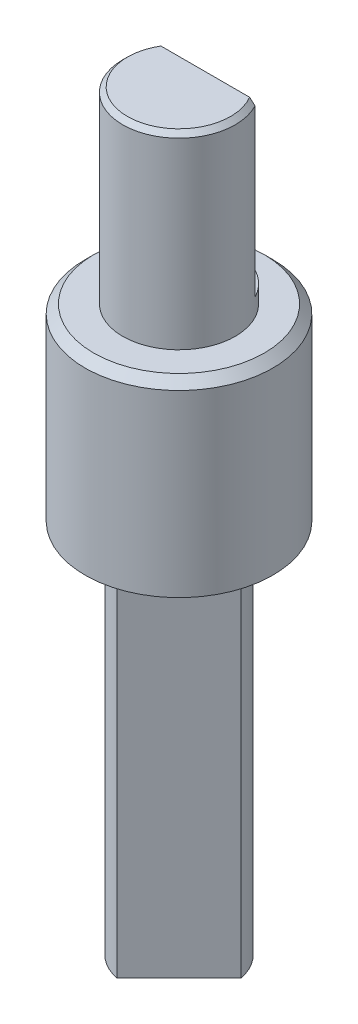
ISO-10303-21;
HEADER;
FILE_DESCRIPTION(('STEP AP214'),'2;1');
FILE_NAME('part.step','',(''),(''),'','','');
FILE_SCHEMA(('AUTOMOTIVE_DESIGN { 1 0 10303 214 1 1 1 1 }'));
ENDSEC;
DATA;
#1=APPLICATION_CONTEXT('core data for automotive mechanical design processes');
#2=APPLICATION_PROTOCOL_DEFINITION('international standard','automotive_design',2000,#1);
#3=PRODUCT_CONTEXT('',#1,'mechanical');
#4=PRODUCT('Part','Part','',(#3));
#5=PRODUCT_RELATED_PRODUCT_CATEGORY('part','',(#4));
#6=PRODUCT_DEFINITION_FORMATION('','',#4);
#7=PRODUCT_DEFINITION_CONTEXT('part definition',#1,'design');
#8=PRODUCT_DEFINITION('design','',#6,#7);
#9=PRODUCT_DEFINITION_SHAPE('','',#8);
#10=(LENGTH_UNIT() NAMED_UNIT(*) SI_UNIT(.MILLI.,.METRE.));
#11=(NAMED_UNIT(*) PLANE_ANGLE_UNIT() SI_UNIT($,.RADIAN.));
#12=(NAMED_UNIT(*) SI_UNIT($,.STERADIAN.) SOLID_ANGLE_UNIT());
#13=UNCERTAINTY_MEASURE_WITH_UNIT(LENGTH_MEASURE(1.E-05),#10,'distance_accuracy_value','');
#14=(GEOMETRIC_REPRESENTATION_CONTEXT(3) GLOBAL_UNCERTAINTY_ASSIGNED_CONTEXT((#13)) GLOBAL_UNIT_ASSIGNED_CONTEXT((#10,
#11,#12)) REPRESENTATION_CONTEXT('',''));
#15=CARTESIAN_POINT('',(0.,0.,0.));
#16=DIRECTION('',(0.,0.,1.));
#17=DIRECTION('',(1.,0.,0.));
#18=AXIS2_PLACEMENT_3D('',#15,#16,#17);
#19=CARTESIAN_POINT('',(0.,20.0152,0.));
#20=DIRECTION('',(0.,-1.,0.));
#21=DIRECTION('',(0.,0.,-1.));
#22=AXIS2_PLACEMENT_3D('',#19,#20,#21);
#23=PLANE('',#22);
#24=CARTESIAN_POINT('',(0.,20.0151999999321,0.));
#25=DIRECTION('',(0.,-1.,0.));
#26=DIRECTION('',(0.,0.,-1.));
#27=AXIS2_PLACEMENT_3D('',#24,#25,#26);
#28=CIRCLE('',#27,2.74319999999761);
#29=CARTESIAN_POINT('',(2.36083401363304,20.015199999943,-1.397));
#30=VERTEX_POINT('',#29);
#31=CARTESIAN_POINT('',(-2.36083401360633,20.015199999966,-1.397));
#32=VERTEX_POINT('',#31);
#33=EDGE_CURVE('E19',#30,#32,#28,.T.);
#34=ORIENTED_EDGE('',*,*,#33,.F.);
#35=DIRECTION('',(1.,0.,0.));
#36=VECTOR('',#35,1.);
#37=CARTESIAN_POINT('',(-2.65171620653493,20.0152,-1.397));
#38=LINE('',#37,#36);
#39=EDGE_CURVE('E97',#30,#32,#38,.F.);
#40=ORIENTED_EDGE('',*,*,#39,.T.);
#41=EDGE_LOOP('',(#34,#40));
#42=FACE_BOUND('',#41,.T.);
#43=ADVANCED_FACE('F16',(#42),#23,.F.);
#44=CARTESIAN_POINT('',(0.,19.7611999999481,0.));
#45=DIRECTION('',(0.,-1.,0.));
#46=DIRECTION('',(0.,0.,-1.));
#47=AXIS2_PLACEMENT_3D('',#44,#45,#46);
#48=CONICAL_SURFACE('',#47,2.9971999999816,0.785398163397448);
#49=ORIENTED_EDGE('',*,*,#33,.T.);
#50=CARTESIAN_POINT('',(-2.36083401362016,20.0151999999541,-1.397));
#51=CARTESIAN_POINT('',(-2.40960348645992,19.9731977034633,-1.397));
#52=CARTESIAN_POINT('',(-2.45822841805287,19.9310298775446,-1.397));
#53=CARTESIAN_POINT('',(-2.5551891487145,19.8463632105385,-1.397));
#54=CARTESIAN_POINT('',(-2.60352494808151,19.8038643697926,-1.397));
#55=CARTESIAN_POINT('',(-2.65171620650003,19.7611999999606,-1.397));
#56=B_SPLINE_CURVE_WITH_KNOTS('',3,(#50,#51,#52,#53,#54,#55),.UNSPECIFIED.,.F.,.F.,(4,2,4),(0.,
0.193086989815871,0.386173780370487),.UNSPECIFIED.);
#57=CARTESIAN_POINT('',(-2.65171620651748,19.7611999999803,-1.397));
#58=VERTEX_POINT('',#57);
#59=EDGE_CURVE('E101',#32,#58,#56,.T.);
#60=ORIENTED_EDGE('',*,*,#59,.T.);
#61=CARTESIAN_POINT('',(0.,19.7612,0.));
#62=DIRECTION('',(0.,1.,0.));
#63=DIRECTION('',(0.,0.,1.));
#64=AXIS2_PLACEMENT_3D('',#61,#62,#63);
#65=CIRCLE('',#64,2.9972);
#66=CARTESIAN_POINT('',(2.65171620651748,19.7611999999803,-1.397));
#67=VERTEX_POINT('',#66);
#68=EDGE_CURVE('E113',#67,#58,#65,.F.);
#69=ORIENTED_EDGE('',*,*,#68,.F.);
#70=CARTESIAN_POINT('',(2.65171620650003,19.7611999999606,-1.397));
#71=CARTESIAN_POINT('',(2.60352494808153,19.8038643697926,-1.397));
#72=CARTESIAN_POINT('',(2.55518914871454,19.8463632105384,-1.397));
#73=CARTESIAN_POINT('',(2.45822841805295,19.9310298775446,-1.397));
#74=CARTESIAN_POINT('',(2.40960348646002,19.9731977034632,-1.397));
#75=CARTESIAN_POINT('',(2.36083401362028,20.015199999954,-1.397));
#76=B_SPLINE_CURVE_WITH_KNOTS('',3,(#70,#71,#72,#73,#74,#75),.UNSPECIFIED.,.F.,.F.,(4,2,4),(0.,
0.193086790554538,0.386173780370333),.UNSPECIFIED.);
#77=EDGE_CURVE('E102',#67,#30,#76,.T.);
#78=ORIENTED_EDGE('',*,*,#77,.T.);
#79=EDGE_LOOP('',(#49,#60,#69,#78));
#80=FACE_BOUND('',#79,.T.);
#81=ADVANCED_FACE('F105',(#80),#48,.T.);
#82=CARTESIAN_POINT('',(0.,10.9474,0.));
#83=DIRECTION('',(0.,1.,0.));
#84=DIRECTION('',(0.,0.,1.));
#85=AXIS2_PLACEMENT_3D('',#82,#83,#84);
#86=PLANE('',#85);
#87=DIRECTION('',(1.,0.,0.));
#88=VECTOR('',#87,1.);
#89=CARTESIAN_POINT('',(-2.65171620653493,10.9474,-1.397));
#90=LINE('',#89,#88);
#91=CARTESIAN_POINT('',(-2.65171620653493,10.9474,-1.397));
#92=VERTEX_POINT('',#91);
#93=CARTESIAN_POINT('',(2.65171620653493,10.9474,-1.397));
#94=VERTEX_POINT('',#93);
#95=EDGE_CURVE('E111',#92,#94,#90,.T.);
#96=ORIENTED_EDGE('',*,*,#95,.T.);
#97=CARTESIAN_POINT('',(0.,10.9474,0.));
#98=DIRECTION('',(0.,1.,0.));
#99=DIRECTION('',(0.,0.,1.));
#100=AXIS2_PLACEMENT_3D('',#97,#98,#99);
#101=CIRCLE('',#100,2.9972);
#102=EDGE_CURVE('E120',#92,#94,#101,.F.);
#103=ORIENTED_EDGE('',*,*,#102,.F.);
#104=EDGE_LOOP('',(#96,#103));
#105=FACE_BOUND('',#104,.T.);
#106=ADVANCED_FACE('F130',(#105),#86,.T.);
#107=CARTESIAN_POINT('',(-2.65171620653493,10.9474,-1.397));
#108=DIRECTION('',(0.,0.,1.));
#109=DIRECTION('',(1.,0.,0.));
#110=AXIS2_PLACEMENT_3D('',#107,#108,#109);
#111=PLANE('',#110);
#112=ORIENTED_EDGE('',*,*,#95,.F.);
#113=DIRECTION('',(0.,1.,0.));
#114=VECTOR('',#113,1.);
#115=CARTESIAN_POINT('',(-2.65171620653493,0.,-1.397));
#116=LINE('',#115,#114);
#117=EDGE_CURVE('E109',#58,#92,#116,.F.);
#118=ORIENTED_EDGE('',*,*,#117,.F.);
#119=ORIENTED_EDGE('',*,*,#59,.F.);
#120=ORIENTED_EDGE('',*,*,#39,.F.);
#121=ORIENTED_EDGE('',*,*,#77,.F.);
#122=DIRECTION('',(0.,1.,0.));
#123=VECTOR('',#122,1.);
#124=CARTESIAN_POINT('',(2.65171620653493,0.,-1.397));
#125=LINE('',#124,#123);
#126=EDGE_CURVE('E210',#94,#67,#125,.T.);
#127=ORIENTED_EDGE('',*,*,#126,.F.);
#128=EDGE_LOOP('',(#112,#118,#119,#120,#121,#127));
#129=FACE_BOUND('',#128,.T.);
#130=ADVANCED_FACE('F107',(#129),#111,.F.);
#131=CARTESIAN_POINT('',(0.,0.,0.));
#132=DIRECTION('',(0.,1.,0.));
#133=DIRECTION('',(0.,0.,1.));
#134=AXIS2_PLACEMENT_3D('',#131,#132,#133);
#135=CYLINDRICAL_SURFACE('',#134,2.9972);
#136=ORIENTED_EDGE('',*,*,#102,.T.);
#137=ORIENTED_EDGE('',*,*,#126,.T.);
#138=ORIENTED_EDGE('',*,*,#68,.T.);
#139=ORIENTED_EDGE('',*,*,#117,.T.);
#140=EDGE_LOOP('',(#136,#137,#138,#139));
#141=FACE_BOUND('',#140,.T.);
#142=CARTESIAN_POINT('',(0.,10.0076,0.));
#143=DIRECTION('',(0.,1.,0.));
#144=DIRECTION('',(0.,0.,1.));
#145=AXIS2_PLACEMENT_3D('',#142,#143,#144);
#146=CIRCLE('',#145,2.9972);
#147=CARTESIAN_POINT('',(0.,10.0076,2.9972));
#148=VERTEX_POINT('',#147);
#149=EDGE_CURVE('E208',#148,#148,#146,.T.);
#150=ORIENTED_EDGE('',*,*,#149,.T.);
#151=EDGE_LOOP('',(#150));
#152=FACE_BOUND('',#151,.T.);
#153=ADVANCED_FACE('F138',(#141,#152),#135,.T.);
#154=CARTESIAN_POINT('',(0.,-19.9898,0.));
#155=DIRECTION('',(0.,1.,0.));
#156=DIRECTION('',(0.,0.,1.));
#157=AXIS2_PLACEMENT_3D('',#154,#155,#156);
#158=PLANE('',#157);
#159=CARTESIAN_POINT('',(0.,-19.9898,0.));
#160=DIRECTION('',(0.,-1.,0.));
#161=DIRECTION('',(0.,0.,-1.));
#162=AXIS2_PLACEMENT_3D('',#159,#160,#161);
#163=CIRCLE('',#162,2.794);
#164=CARTESIAN_POINT('',(2.73350814544977,-19.9898,-0.578246676393178));
#165=VERTEX_POINT('',#164);
#166=CARTESIAN_POINT('',(0.578246676393178,-19.9898,-2.73350814544977));
#167=VERTEX_POINT('',#166);
#168=EDGE_CURVE('E219',#165,#167,#163,.F.);
#169=ORIENTED_EDGE('',*,*,#168,.F.);
#170=DIRECTION('',(0.707106781186547,0.,-0.707106781186548));
#171=VECTOR('',#170,1.);
#172=CARTESIAN_POINT('',(-0.578246676393173,-19.9898,2.73350814544976));
#173=LINE('',#172,#171);
#174=CARTESIAN_POINT('',(-0.578246676393178,-19.9898,2.73350814544977));
#175=VERTEX_POINT('',#174);
#176=EDGE_CURVE('E212',#175,#165,#173,.T.);
#177=ORIENTED_EDGE('',*,*,#176,.F.);
#178=CARTESIAN_POINT('',(0.,-19.9898,0.));
#179=DIRECTION('',(0.,-1.,0.));
#180=DIRECTION('',(0.,0.,-1.));
#181=AXIS2_PLACEMENT_3D('',#178,#179,#180);
#182=CIRCLE('',#181,2.794);
#183=CARTESIAN_POINT('',(-2.73350814544976,-19.9898,0.578246676393176));
#184=VERTEX_POINT('',#183);
#185=EDGE_CURVE('E216',#184,#175,#182,.F.);
#186=ORIENTED_EDGE('',*,*,#185,.F.);
#187=DIRECTION('',(-0.707106781186547,0.,0.707106781186548));
#188=VECTOR('',#187,1.);
#189=CARTESIAN_POINT('',(0.578246676393173,-19.9898,-2.73350814544976));
#190=LINE('',#189,#188);
#191=EDGE_CURVE('E233',#167,#184,#190,.T.);
#192=ORIENTED_EDGE('',*,*,#191,.F.);
#193=EDGE_LOOP('',(#169,#177,#186,#192));
#194=FACE_BOUND('',#193,.T.);
#195=ADVANCED_FACE('F194',(#194),#158,.F.);
#196=CARTESIAN_POINT('',(0.,10.0076,-2.9972));
#197=DIRECTION('',(0.,-1.,0.));
#198=DIRECTION('',(0.,0.,-1.));
#199=AXIS2_PLACEMENT_3D('',#196,#197,#198);
#200=PLANE('',#199);
#201=ORIENTED_EDGE('',*,*,#149,.F.);
#202=EDGE_LOOP('',(#201));
#203=FACE_BOUND('',#202,.T.);
#204=CARTESIAN_POINT('',(0.,10.0075999999945,0.));
#205=DIRECTION('',(0.,-1.,0.));
#206=DIRECTION('',(0.,0.,-1.));
#207=AXIS2_PLACEMENT_3D('',#204,#205,#206);
#208=CIRCLE('',#207,4.54000000001997);
#209=CARTESIAN_POINT('',(0.,10.0075999999945,-4.54000000001997));
#210=VERTEX_POINT('',#209);
#211=EDGE_CURVE('E167',#210,#210,#208,.T.);
#212=ORIENTED_EDGE('',*,*,#211,.F.);
#213=EDGE_LOOP('',(#212));
#214=FACE_BOUND('',#213,.T.);
#215=ADVANCED_FACE('F189',(#203,#214),#200,.F.);
#216=CARTESIAN_POINT('',(-3.50229988721698,25.4,-2.96348451995281));
#217=DIRECTION('',(-0.707106781186548,0.,-0.707106781186548));
#218=DIRECTION('',(-0.707106781186548,0.,0.707106781186548));
#219=AXIS2_PLACEMENT_3D('',#216,#217,#218);
#220=PLANE('',#219);
#221=DIRECTION('',(-0.707106781186548,0.,0.707106781186548));
#222=VECTOR('',#221,1.);
#223=CARTESIAN_POINT('',(-3.50229988721698,0.,-2.96348451995281));
#224=LINE('',#223,#222);
#225=CARTESIAN_POINT('',(-2.96348451995281,0.,-3.50229988721698));
#226=VERTEX_POINT('',#225);
#227=CARTESIAN_POINT('',(-3.50229988721697,0.,-2.96348451995282));
#228=VERTEX_POINT('',#227);
#229=EDGE_CURVE('E209',#226,#228,#224,.T.);
#230=ORIENTED_EDGE('',*,*,#229,.T.);
#231=DIRECTION('',(0.,1.,0.));
#232=VECTOR('',#231,1.);
#233=CARTESIAN_POINT('',(-3.50229988721696,25.4,-2.96348451995282));
#234=LINE('',#233,#232);
#235=CARTESIAN_POINT('',(-3.50229988721751,9.9597524654945,-2.96348451995228));
#236=VERTEX_POINT('',#235);
#237=EDGE_CURVE('E166',#236,#228,#234,.F.);
#238=ORIENTED_EDGE('',*,*,#237,.F.);
#239=CARTESIAN_POINT('',(-2.96348455951795,9.95975249371569,-3.50229994728442));
#240=CARTESIAN_POINT('',(-3.05328709766137,9.97031750260145,-3.41249735932471));
#241=CARTESIAN_POINT('',(-3.14308964396942,9.97560000470103,-3.3226947798058));
#242=CARTESIAN_POINT('',(-3.32269475320279,9.97559999532783,-3.14308963736157));
#243=CARTESIAN_POINT('',(-3.41249731612811,9.97031748382117,-3.05328707443625));
#244=CARTESIAN_POINT('',(-3.50229988721805,9.95975246549444,-2.96348451995173));
#245=B_SPLINE_CURVE_WITH_KNOTS('',3,(#239,#240,#241,#242,#243,#244),.UNSPECIFIED.,.F.,.F.,(4,2,
4),(0.,0.381329449375232,0.762658899973495),.UNSPECIFIED.);
#246=CARTESIAN_POINT('',(-2.96348451568527,9.95975246499336,-3.50229989148452));
#247=VERTEX_POINT('',#246);
#248=EDGE_CURVE('E172',#247,#236,#245,.T.);
#249=ORIENTED_EDGE('',*,*,#248,.F.);
#250=DIRECTION('',(0.,1.,0.));
#251=VECTOR('',#250,1.);
#252=CARTESIAN_POINT('',(-2.96348451995281,25.4,-3.50229988721698));
#253=LINE('',#252,#251);
#254=EDGE_CURVE('E227',#226,#247,#253,.T.);
#255=ORIENTED_EDGE('',*,*,#254,.F.);
#256=EDGE_LOOP('',(#230,#238,#249,#255));
#257=FACE_BOUND('',#256,.T.);
#258=ADVANCED_FACE('F183',(#257),#220,.T.);
#259=CARTESIAN_POINT('',(-0.578246676393173,-19.9898,2.73350814544976));
#260=DIRECTION('',(0.707106781186548,0.,0.707106781186547));
#261=DIRECTION('',(0.707106781186547,0.,-0.707106781186548));
#262=AXIS2_PLACEMENT_3D('',#259,#260,#261);
#263=PLANE('',#262);
#264=ORIENTED_EDGE('',*,*,#176,.T.);
#265=DIRECTION('',(0.,-1.,0.));
#266=VECTOR('',#265,1.);
#267=CARTESIAN_POINT('',(2.73350814544977,-19.9898,-0.578246676393175));
#268=LINE('',#267,#266);
#269=CARTESIAN_POINT('',(2.73350814544977,0.,-0.578246676393178));
#270=VERTEX_POINT('',#269);
#271=EDGE_CURVE('E222',#270,#165,#268,.T.);
#272=ORIENTED_EDGE('',*,*,#271,.F.);
#273=DIRECTION('',(-0.707106781186548,0.,0.707106781186547));
#274=VECTOR('',#273,1.);
#275=CARTESIAN_POINT('',(2.73350814544976,0.,-0.578246676393173));
#276=LINE('',#275,#274);
#277=CARTESIAN_POINT('',(-0.578246676393179,0.,2.73350814544977));
#278=VERTEX_POINT('',#277);
#279=EDGE_CURVE('E256',#270,#278,#276,.T.);
#280=ORIENTED_EDGE('',*,*,#279,.T.);
#281=DIRECTION('',(0.,-1.,0.));
#282=VECTOR('',#281,1.);
#283=CARTESIAN_POINT('',(-0.578246676393177,-19.9898,2.73350814544977));
#284=LINE('',#283,#282);
#285=EDGE_CURVE('E218',#175,#278,#284,.F.);
#286=ORIENTED_EDGE('',*,*,#285,.F.);
#287=EDGE_LOOP('',(#264,#272,#280,#286));
#288=FACE_BOUND('',#287,.T.);
#289=ADVANCED_FACE('F188',(#288),#263,.T.);
#290=CARTESIAN_POINT('',(0.,-19.9898,0.));
#291=DIRECTION('',(0.,-1.,0.));
#292=DIRECTION('',(0.,0.,-1.));
#293=AXIS2_PLACEMENT_3D('',#290,#291,#292);
#294=CYLINDRICAL_SURFACE('',#293,2.794);
#295=ORIENTED_EDGE('',*,*,#185,.T.);
#296=ORIENTED_EDGE('',*,*,#285,.T.);
#297=CARTESIAN_POINT('',(0.,0.,0.));
#298=DIRECTION('',(0.,-1.,0.));
#299=DIRECTION('',(0.,0.,-1.));
#300=AXIS2_PLACEMENT_3D('',#297,#298,#299);
#301=CIRCLE('',#300,2.794);
#302=CARTESIAN_POINT('',(-2.73350814544977,0.,0.578246676393174));
#303=VERTEX_POINT('',#302);
#304=EDGE_CURVE('E168',#278,#303,#301,.T.);
#305=ORIENTED_EDGE('',*,*,#304,.T.);
#306=DIRECTION('',(0.,1.,0.));
#307=VECTOR('',#306,1.);
#308=CARTESIAN_POINT('',(-2.73350814544976,-19.9898,0.578246676393173));
#309=LINE('',#308,#307);
#310=EDGE_CURVE('E229',#184,#303,#309,.T.);
#311=ORIENTED_EDGE('',*,*,#310,.F.);
#312=EDGE_LOOP('',(#295,#296,#305,#311));
#313=FACE_BOUND('',#312,.T.);
#314=ADVANCED_FACE('F290',(#313),#294,.T.);
#315=CARTESIAN_POINT('',(0.578246676393173,-19.9898,-2.73350814544976));
#316=DIRECTION('',(-0.707106781186548,0.,-0.707106781186547));
#317=DIRECTION('',(-0.707106781186547,0.,0.707106781186548));
#318=AXIS2_PLACEMENT_3D('',#315,#316,#317);
#319=PLANE('',#318);
#320=ORIENTED_EDGE('',*,*,#191,.T.);
#321=ORIENTED_EDGE('',*,*,#310,.T.);
#322=DIRECTION('',(0.707106781186548,0.,-0.707106781186547));
#323=VECTOR('',#322,1.);
#324=CARTESIAN_POINT('',(-2.73350814544976,0.,0.578246676393171));
#325=LINE('',#324,#323);
#326=CARTESIAN_POINT('',(0.578246676393178,0.,-2.73350814544977));
#327=VERTEX_POINT('',#326);
#328=EDGE_CURVE('E247',#303,#327,#325,.T.);
#329=ORIENTED_EDGE('',*,*,#328,.T.);
#330=DIRECTION('',(0.,-1.,0.));
#331=VECTOR('',#330,1.);
#332=CARTESIAN_POINT('',(0.578246676393175,-19.9898,-2.73350814544977));
#333=LINE('',#332,#331);
#334=EDGE_CURVE('E221',#167,#327,#333,.F.);
#335=ORIENTED_EDGE('',*,*,#334,.F.);
#336=EDGE_LOOP('',(#320,#321,#329,#335));
#337=FACE_BOUND('',#336,.T.);
#338=ADVANCED_FACE('F292',(#337),#319,.T.);
#339=CARTESIAN_POINT('',(0.,-19.9898,0.));
#340=DIRECTION('',(0.,-1.,0.));
#341=DIRECTION('',(0.,0.,-1.));
#342=AXIS2_PLACEMENT_3D('',#339,#340,#341);
#343=CYLINDRICAL_SURFACE('',#342,2.794);
#344=ORIENTED_EDGE('',*,*,#168,.T.);
#345=ORIENTED_EDGE('',*,*,#334,.T.);
#346=CARTESIAN_POINT('',(0.,0.,0.));
#347=DIRECTION('',(0.,-1.,0.));
#348=DIRECTION('',(0.,0.,-1.));
#349=AXIS2_PLACEMENT_3D('',#346,#347,#348);
#350=CIRCLE('',#349,2.794);
#351=EDGE_CURVE('E245',#327,#270,#350,.T.);
#352=ORIENTED_EDGE('',*,*,#351,.T.);
#353=ORIENTED_EDGE('',*,*,#271,.T.);
#354=EDGE_LOOP('',(#344,#345,#352,#353));
#355=FACE_BOUND('',#354,.T.);
#356=ADVANCED_FACE('F293',(#355),#343,.T.);
#357=CARTESIAN_POINT('',(-2.96348451995281,25.4,-3.50229988721698));
#358=DIRECTION('',(-0.707106781186548,0.,0.707106781186547));
#359=DIRECTION('',(0.707106781186547,0.,0.707106781186548));
#360=AXIS2_PLACEMENT_3D('',#357,#358,#359);
#361=PLANE('',#360);
#362=DIRECTION('',(0.707106781186548,0.,0.707106781186547));
#363=VECTOR('',#362,1.);
#364=CARTESIAN_POINT('',(-3.25584684618559,0.,-3.79466221344975));
#365=LINE('',#364,#363);
#366=CARTESIAN_POINT('',(-3.25584684618558,0.,-3.79466221344974));
#367=VERTEX_POINT('',#366);
#368=EDGE_CURVE('E246',#367,#226,#365,.T.);
#369=ORIENTED_EDGE('',*,*,#368,.T.);
#370=ORIENTED_EDGE('',*,*,#254,.T.);
#371=CARTESIAN_POINT('',(-3.25584684618653,9.54760000001309,-3.7946622134507));
#372=CARTESIAN_POINT('',(-3.20712645702054,9.61630148657173,-3.74594182428471));
#373=CARTESIAN_POINT('',(-3.15840274356347,9.68499825692674,-3.69721811082763));
#374=CARTESIAN_POINT('',(-3.06094866804752,9.82238236525719,-3.59976403531169));
#375=CARTESIAN_POINT('',(-3.01221830598865,9.89106970323262,-3.55103367325281));
#376=CARTESIAN_POINT('',(-2.96348461963868,9.95975232500442,-3.50229998690285));
#377=B_SPLINE_CURVE_WITH_KNOTS('',3,(#371,#372,#373,#374,#375,#376),.UNSPECIFIED.,.F.,.F.,(4,2,
4),(0.,0.291899333452021,0.583798667021589),.UNSPECIFIED.);
#378=CARTESIAN_POINT('',(-3.25584684618606,9.54760000000654,-3.79466221345022));
#379=VERTEX_POINT('',#378);
#380=EDGE_CURVE('E178',#379,#247,#377,.T.);
#381=ORIENTED_EDGE('',*,*,#380,.F.);
#382=DIRECTION('',(0.,1.,0.));
#383=VECTOR('',#382,1.);
#384=CARTESIAN_POINT('',(-3.25584684618558,0.,-3.79466221344974));
#385=LINE('',#384,#383);
#386=EDGE_CURVE('E263',#367,#379,#385,.T.);
#387=ORIENTED_EDGE('',*,*,#386,.F.);
#388=EDGE_LOOP('',(#369,#370,#381,#387));
#389=FACE_BOUND('',#388,.T.);
#390=ADVANCED_FACE('F279',(#389),#361,.T.);
#391=CARTESIAN_POINT('',(0.,9.54760000001897,0.));
#392=DIRECTION('',(0.,-1.,0.));
#393=DIRECTION('',(0.,0.,-1.));
#394=AXIS2_PLACEMENT_3D('',#391,#392,#393);
#395=CONICAL_SURFACE('',#394,4.99999999999545,0.785398163397448);
#396=ORIENTED_EDGE('',*,*,#211,.T.);
#397=EDGE_LOOP('',(#396));
#398=FACE_BOUND('',#397,.T.);
#399=ORIENTED_EDGE('',*,*,#248,.T.);
#400=CARTESIAN_POINT('',(-3.79466221345484,9.54760000000723,-3.2558468461907));
#401=CARTESIAN_POINT('',(-3.74594180767978,9.61630150998718,-3.20712644041564));
#402=CARTESIAN_POINT('',(-3.69721807761121,9.68499830376008,-3.15840271034708));
#403=CARTESIAN_POINT('',(-3.59976396886745,9.82238245891944,-3.06094860160331));
#404=CARTESIAN_POINT('',(-3.55103359019225,9.89106982030589,-3.01221822292811));
#405=CARTESIAN_POINT('',(-3.50229988722354,9.95975246548529,-2.96348451995941));
#406=B_SPLINE_CURVE_WITH_KNOTS('',3,(#400,#401,#402,#403,#404,#405),.UNSPECIFIED.,.F.,.F.,(4,2,
4),(0.,0.291899432963454,0.583798866044457),.UNSPECIFIED.);
#407=CARTESIAN_POINT('',(-3.79466221345229,9.54760000000361,-3.25584684618814));
#408=VERTEX_POINT('',#407);
#409=EDGE_CURVE('E159',#408,#236,#406,.T.);
#410=ORIENTED_EDGE('',*,*,#409,.F.);
#411=CARTESIAN_POINT('',(0.,9.54759999999998,0.));
#412=DIRECTION('',(0.,1.,0.));
#413=DIRECTION('',(0.,0.,1.));
#414=AXIS2_PLACEMENT_3D('',#411,#412,#413);
#415=CIRCLE('',#414,4.99999999999999);
#416=EDGE_CURVE('E262',#379,#408,#415,.F.);
#417=ORIENTED_EDGE('',*,*,#416,.F.);
#418=ORIENTED_EDGE('',*,*,#380,.T.);
#419=EDGE_LOOP('',(#399,#410,#417,#418));
#420=FACE_BOUND('',#419,.T.);
#421=ADVANCED_FACE('F155',(#398,#420),#395,.T.);
#422=CARTESIAN_POINT('',(-4.04111525448111,25.4,-3.50229988721698));
#423=DIRECTION('',(0.707106781186548,0.,-0.707106781186547));
#424=DIRECTION('',(-0.707106781186547,0.,-0.707106781186548));
#425=AXIS2_PLACEMENT_3D('',#422,#423,#424);
#426=PLANE('',#425);
#427=DIRECTION('',(-0.707106781186547,0.,-0.707106781186548));
#428=VECTOR('',#427,1.);
#429=CARTESIAN_POINT('',(-3.50229988721698,0.,-2.96348451995281));
#430=LINE('',#429,#428);
#431=CARTESIAN_POINT('',(-3.79466221344974,0.,-3.25584684618558));
#432=VERTEX_POINT('',#431);
#433=EDGE_CURVE('E34',#228,#432,#430,.T.);
#434=ORIENTED_EDGE('',*,*,#433,.T.);
#435=DIRECTION('',(0.,1.,0.));
#436=VECTOR('',#435,1.);
#437=CARTESIAN_POINT('',(-3.79466221344974,0.,-3.25584684618558));
#438=LINE('',#437,#436);
#439=EDGE_CURVE('E25',#408,#432,#438,.F.);
#440=ORIENTED_EDGE('',*,*,#439,.F.);
#441=ORIENTED_EDGE('',*,*,#409,.T.);
#442=ORIENTED_EDGE('',*,*,#237,.T.);
#443=EDGE_LOOP('',(#434,#440,#441,#442));
#444=FACE_BOUND('',#443,.T.);
#445=ADVANCED_FACE('F147',(#444),#426,.T.);
#446=CARTESIAN_POINT('',(0.,0.,-4.99999999999999));
#447=DIRECTION('',(0.,1.,0.));
#448=DIRECTION('',(0.,0.,1.));
#449=AXIS2_PLACEMENT_3D('',#446,#447,#448);
#450=PLANE('',#449);
#451=ORIENTED_EDGE('',*,*,#229,.F.);
#452=ORIENTED_EDGE('',*,*,#368,.F.);
#453=CARTESIAN_POINT('',(0.,0.,0.));
#454=DIRECTION('',(0.,1.,0.));
#455=DIRECTION('',(0.,0.,1.));
#456=AXIS2_PLACEMENT_3D('',#453,#454,#455);
#457=CIRCLE('',#456,4.99999999999999);
#458=EDGE_CURVE('E11',#432,#367,#457,.T.);
#459=ORIENTED_EDGE('',*,*,#458,.F.);
#460=ORIENTED_EDGE('',*,*,#433,.F.);
#461=EDGE_LOOP('',(#451,#452,#459,#460));
#462=FACE_BOUND('',#461,.T.);
#463=ORIENTED_EDGE('',*,*,#328,.F.);
#464=ORIENTED_EDGE('',*,*,#304,.F.);
#465=ORIENTED_EDGE('',*,*,#279,.F.);
#466=ORIENTED_EDGE('',*,*,#351,.F.);
#467=EDGE_LOOP('',(#463,#464,#465,#466));
#468=FACE_BOUND('',#467,.T.);
#469=ADVANCED_FACE('F141',(#462,#468),#450,.F.);
#470=CARTESIAN_POINT('',(0.,0.,0.));
#471=DIRECTION('',(0.,1.,0.));
#472=DIRECTION('',(0.,0.,1.));
#473=AXIS2_PLACEMENT_3D('',#470,#471,#472);
#474=CYLINDRICAL_SURFACE('',#473,4.99999999999999);
#475=ORIENTED_EDGE('',*,*,#439,.T.);
#476=ORIENTED_EDGE('',*,*,#458,.T.);
#477=ORIENTED_EDGE('',*,*,#386,.T.);
#478=ORIENTED_EDGE('',*,*,#416,.T.);
#479=EDGE_LOOP('',(#475,#476,#477,#478));
#480=FACE_BOUND('',#479,.T.);
#481=ADVANCED_FACE('F139',(#480),#474,.T.);
#482=CLOSED_SHELL('',(#43,#81,#106,#130,#153,#195,#215,#258,#289,#314,#338,#356,#390,#421,#445,
#469,#481));
#483=MANIFOLD_SOLID_BREP('B1',#482);
#484=ADVANCED_BREP_SHAPE_REPRESENTATION('',(#18,#483),#14);
#485=SHAPE_DEFINITION_REPRESENTATION(#9,#484);
ENDSEC;
END-ISO-10303-21;
